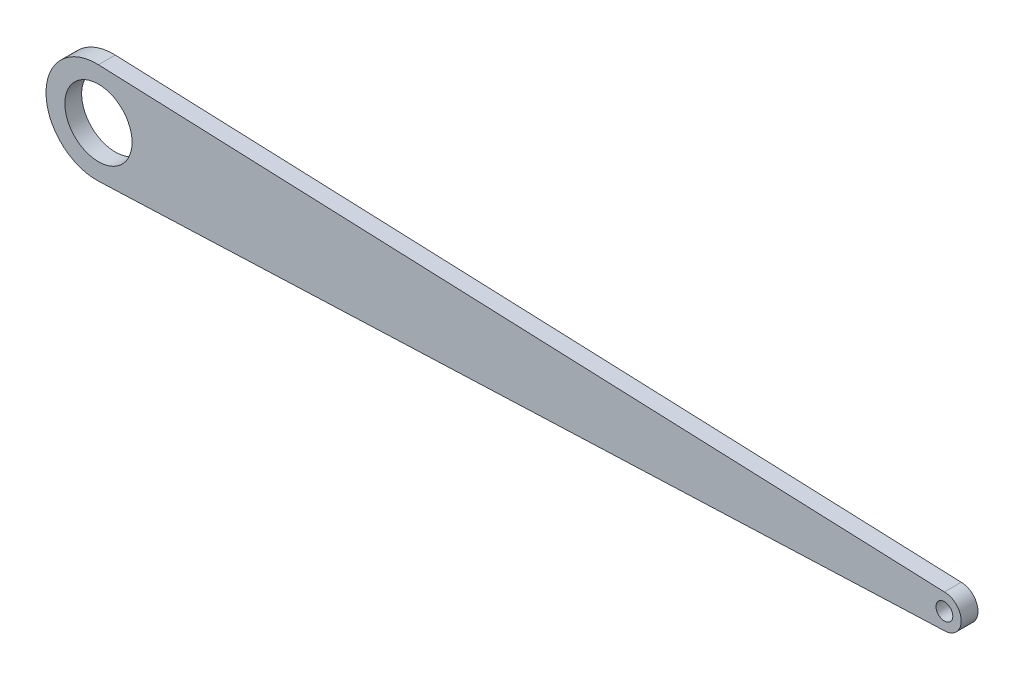
ISO-10303-21;
HEADER;
FILE_DESCRIPTION(('STEP AP214'),'2;1');
FILE_NAME('part.step','',(''),(''),'','','');
FILE_SCHEMA(('AUTOMOTIVE_DESIGN { 1 0 10303 214 1 1 1 1 }'));
ENDSEC;
DATA;
#1=APPLICATION_CONTEXT('core data for automotive mechanical design processes');
#2=APPLICATION_PROTOCOL_DEFINITION('international standard','automotive_design',2000,#1);
#3=PRODUCT_CONTEXT('',#1,'mechanical');
#4=PRODUCT('Part','Part','',(#3));
#5=PRODUCT_RELATED_PRODUCT_CATEGORY('part','',(#4));
#6=PRODUCT_DEFINITION_FORMATION('','',#4);
#7=PRODUCT_DEFINITION_CONTEXT('part definition',#1,'design');
#8=PRODUCT_DEFINITION('design','',#6,#7);
#9=PRODUCT_DEFINITION_SHAPE('','',#8);
#10=(LENGTH_UNIT() NAMED_UNIT(*) SI_UNIT(.MILLI.,.METRE.));
#11=(NAMED_UNIT(*) PLANE_ANGLE_UNIT() SI_UNIT($,.RADIAN.));
#12=(NAMED_UNIT(*) SI_UNIT($,.STERADIAN.) SOLID_ANGLE_UNIT());
#13=UNCERTAINTY_MEASURE_WITH_UNIT(LENGTH_MEASURE(1.E-05),#10,'distance_accuracy_value','');
#14=(GEOMETRIC_REPRESENTATION_CONTEXT(3) GLOBAL_UNCERTAINTY_ASSIGNED_CONTEXT((#13)) GLOBAL_UNIT_ASSIGNED_CONTEXT((#10,
#11,#12)) REPRESENTATION_CONTEXT('',''));
#15=CARTESIAN_POINT('',(0.,0.,0.));
#16=DIRECTION('',(0.,0.,1.));
#17=DIRECTION('',(1.,0.,0.));
#18=AXIS2_PLACEMENT_3D('',#15,#16,#17);
#19=CARTESIAN_POINT('',(125.899022009944,0.,5.));
#20=DIRECTION('',(0.,0.,-1.));
#21=DIRECTION('',(-1.,0.,0.));
#22=AXIS2_PLACEMENT_3D('',#19,#20,#21);
#23=PLANE('',#22);
#24=CARTESIAN_POINT('',(125.899022009944,0.,5.));
#25=DIRECTION('',(0.,0.,1.));
#26=DIRECTION('',(-1.,0.,0.));
#27=AXIS2_PLACEMENT_3D('',#24,#25,#26);
#28=CIRCLE('',#27,5.);
#29=CARTESIAN_POINT('',(125.899022009944,-5.,5.));
#30=VERTEX_POINT('',#29);
#31=CARTESIAN_POINT('',(125.899022009944,5.,5.));
#32=VERTEX_POINT('',#31);
#33=EDGE_CURVE('E96',#30,#32,#28,.T.);
#34=ORIENTED_EDGE('',*,*,#33,.T.);
#35=DIRECTION('',(-0.999211577977909,0.0397016679107561,0.));
#36=VECTOR('',#35,1.);
#37=CARTESIAN_POINT('',(-125.780977990056,15.,5.));
#38=LINE('',#37,#36);
#39=CARTESIAN_POINT('',(-125.780977990056,15.,5.));
#40=VERTEX_POINT('',#39);
#41=EDGE_CURVE('E91',#32,#40,#38,.T.);
#42=ORIENTED_EDGE('',*,*,#41,.T.);
#43=CARTESIAN_POINT('',(-126.376972904232,0.,5.));
#44=DIRECTION('',(0.,0.,1.));
#45=DIRECTION('',(1.,0.,0.));
#46=AXIS2_PLACEMENT_3D('',#43,#44,#45);
#47=CIRCLE('',#46,15.0118356618278);
#48=CARTESIAN_POINT('',(-125.780977990056,-15.,5.));
#49=VERTEX_POINT('',#48);
#50=EDGE_CURVE('E94',#40,#49,#47,.T.);
#51=ORIENTED_EDGE('',*,*,#50,.T.);
#52=DIRECTION('',(0.999211577977909,0.0397016679107561,0.));
#53=VECTOR('',#52,1.);
#54=CARTESIAN_POINT('',(125.899022009944,-5.,5.));
#55=LINE('',#54,#53);
#56=EDGE_CURVE('E61',#49,#30,#55,.T.);
#57=ORIENTED_EDGE('',*,*,#56,.T.);
#58=EDGE_LOOP('',(#34,#42,#51,#57));
#59=FACE_BOUND('',#58,.T.);
#60=CARTESIAN_POINT('',(125.899022009944,0.,5.));
#61=DIRECTION('',(0.,0.,1.));
#62=DIRECTION('',(1.,0.,0.));
#63=AXIS2_PLACEMENT_3D('',#60,#61,#62);
#64=CIRCLE('',#63,2.5);
#65=CARTESIAN_POINT('',(128.399022009944,0.,5.));
#66=VERTEX_POINT('',#65);
#67=EDGE_CURVE('E116',#66,#66,#64,.T.);
#68=ORIENTED_EDGE('',*,*,#67,.F.);
#69=EDGE_LOOP('',(#68));
#70=FACE_BOUND('',#69,.T.);
#71=CARTESIAN_POINT('',(-125.780977990056,0.,5.));
#72=DIRECTION('',(0.,0.,1.));
#73=DIRECTION('',(1.,0.,0.));
#74=AXIS2_PLACEMENT_3D('',#71,#72,#73);
#75=CIRCLE('',#74,9.99999999999999);
#76=CARTESIAN_POINT('',(-115.780977990056,0.,5.));
#77=VERTEX_POINT('',#76);
#78=EDGE_CURVE('E138',#77,#77,#75,.T.);
#79=ORIENTED_EDGE('',*,*,#78,.F.);
#80=EDGE_LOOP('',(#79));
#81=FACE_BOUND('',#80,.T.);
#82=ADVANCED_FACE('F43',(#59,#70,#81),#23,.F.);
#83=CARTESIAN_POINT('',(125.899022009944,0.,0.));
#84=DIRECTION('',(0.,0.,-1.));
#85=DIRECTION('',(-1.,0.,0.));
#86=AXIS2_PLACEMENT_3D('',#83,#84,#85);
#87=PLANE('',#86);
#88=CARTESIAN_POINT('',(125.899022009944,0.,0.));
#89=DIRECTION('',(0.,0.,1.));
#90=DIRECTION('',(1.,0.,0.));
#91=AXIS2_PLACEMENT_3D('',#88,#89,#90);
#92=CIRCLE('',#91,2.5);
#93=CARTESIAN_POINT('',(128.399022009944,0.,0.));
#94=VERTEX_POINT('',#93);
#95=EDGE_CURVE('E134',#94,#94,#92,.T.);
#96=ORIENTED_EDGE('',*,*,#95,.T.);
#97=EDGE_LOOP('',(#96));
#98=FACE_BOUND('',#97,.T.);
#99=CARTESIAN_POINT('',(125.899022009944,0.,0.));
#100=DIRECTION('',(0.,0.,1.));
#101=DIRECTION('',(-1.,0.,0.));
#102=AXIS2_PLACEMENT_3D('',#99,#100,#101);
#103=CIRCLE('',#102,5.);
#104=CARTESIAN_POINT('',(125.899022009944,-5.,0.));
#105=VERTEX_POINT('',#104);
#106=CARTESIAN_POINT('',(125.899022009944,5.,0.));
#107=VERTEX_POINT('',#106);
#108=EDGE_CURVE('E112',#105,#107,#103,.T.);
#109=ORIENTED_EDGE('',*,*,#108,.F.);
#110=DIRECTION('',(0.999211577977909,0.0397016679107561,0.));
#111=VECTOR('',#110,1.);
#112=CARTESIAN_POINT('',(125.899022009944,-5.,0.));
#113=LINE('',#112,#111);
#114=CARTESIAN_POINT('',(-125.780977990056,-15.,0.));
#115=VERTEX_POINT('',#114);
#116=EDGE_CURVE('E84',#115,#105,#113,.T.);
#117=ORIENTED_EDGE('',*,*,#116,.F.);
#118=CARTESIAN_POINT('',(-126.376972904232,0.,0.));
#119=DIRECTION('',(0.,0.,1.));
#120=DIRECTION('',(1.,0.,0.));
#121=AXIS2_PLACEMENT_3D('',#118,#119,#120);
#122=CIRCLE('',#121,15.0118356618278);
#123=CARTESIAN_POINT('',(-125.780977990056,15.,0.));
#124=VERTEX_POINT('',#123);
#125=EDGE_CURVE('E78',#124,#115,#122,.T.);
#126=ORIENTED_EDGE('',*,*,#125,.F.);
#127=DIRECTION('',(-0.999211577977909,0.0397016679107561,0.));
#128=VECTOR('',#127,1.);
#129=CARTESIAN_POINT('',(-125.780977990056,15.,0.));
#130=LINE('',#129,#128);
#131=EDGE_CURVE('E101',#107,#124,#130,.T.);
#132=ORIENTED_EDGE('',*,*,#131,.F.);
#133=EDGE_LOOP('',(#109,#117,#126,#132));
#134=FACE_BOUND('',#133,.T.);
#135=CARTESIAN_POINT('',(-125.780977990056,0.,0.));
#136=DIRECTION('',(0.,0.,1.));
#137=DIRECTION('',(1.,0.,0.));
#138=AXIS2_PLACEMENT_3D('',#135,#136,#137);
#139=CIRCLE('',#138,9.99999999999999);
#140=CARTESIAN_POINT('',(-115.780977990056,0.,0.));
#141=VERTEX_POINT('',#140);
#142=EDGE_CURVE('E142',#141,#141,#139,.T.);
#143=ORIENTED_EDGE('',*,*,#142,.T.);
#144=EDGE_LOOP('',(#143));
#145=FACE_BOUND('',#144,.T.);
#146=ADVANCED_FACE('F129',(#98,#134,#145),#87,.T.);
#147=CARTESIAN_POINT('',(125.899022009944,0.,5.));
#148=DIRECTION('',(0.,0.,-1.));
#149=DIRECTION('',(-1.,0.,0.));
#150=AXIS2_PLACEMENT_3D('',#147,#148,#149);
#151=CYLINDRICAL_SURFACE('',#150,5.);
#152=ORIENTED_EDGE('',*,*,#108,.T.);
#153=DIRECTION('',(0.,0.,-1.));
#154=VECTOR('',#153,1.);
#155=CARTESIAN_POINT('',(125.899022009944,5.,5.));
#156=LINE('',#155,#154);
#157=EDGE_CURVE('E11',#32,#107,#156,.T.);
#158=ORIENTED_EDGE('',*,*,#157,.F.);
#159=ORIENTED_EDGE('',*,*,#33,.F.);
#160=DIRECTION('',(0.,0.,-1.));
#161=VECTOR('',#160,1.);
#162=CARTESIAN_POINT('',(125.899022009944,-5.,5.));
#163=LINE('',#162,#161);
#164=EDGE_CURVE('E108',#30,#105,#163,.T.);
#165=ORIENTED_EDGE('',*,*,#164,.T.);
#166=EDGE_LOOP('',(#152,#158,#159,#165));
#167=FACE_BOUND('',#166,.T.);
#168=ADVANCED_FACE('F45',(#167),#151,.T.);
#169=CARTESIAN_POINT('',(-125.780977990056,15.,5.));
#170=DIRECTION('',(-0.0397016679107561,-0.99921157797791,0.));
#171=DIRECTION('',(0.99921157797791,-0.0397016679107561,0.));
#172=AXIS2_PLACEMENT_3D('',#169,#170,#171);
#173=PLANE('',#172);
#174=ORIENTED_EDGE('',*,*,#131,.T.);
#175=DIRECTION('',(0.,0.,-1.));
#176=VECTOR('',#175,1.);
#177=CARTESIAN_POINT('',(-125.780977990056,15.,5.));
#178=LINE('',#177,#176);
#179=EDGE_CURVE('E53',#40,#124,#178,.T.);
#180=ORIENTED_EDGE('',*,*,#179,.F.);
#181=ORIENTED_EDGE('',*,*,#41,.F.);
#182=ORIENTED_EDGE('',*,*,#157,.T.);
#183=EDGE_LOOP('',(#174,#180,#181,#182));
#184=FACE_BOUND('',#183,.T.);
#185=ADVANCED_FACE('F100',(#184),#173,.F.);
#186=CARTESIAN_POINT('',(-126.376972904232,0.,5.));
#187=DIRECTION('',(0.,0.,-1.));
#188=DIRECTION('',(-1.,0.,0.));
#189=AXIS2_PLACEMENT_3D('',#186,#187,#188);
#190=CYLINDRICAL_SURFACE('',#189,15.0118356618278);
#191=ORIENTED_EDGE('',*,*,#125,.T.);
#192=DIRECTION('',(0.,0.,-1.));
#193=VECTOR('',#192,1.);
#194=CARTESIAN_POINT('',(-125.780977990056,-15.,5.));
#195=LINE('',#194,#193);
#196=EDGE_CURVE('E103',#49,#115,#195,.T.);
#197=ORIENTED_EDGE('',*,*,#196,.F.);
#198=ORIENTED_EDGE('',*,*,#50,.F.);
#199=ORIENTED_EDGE('',*,*,#179,.T.);
#200=EDGE_LOOP('',(#191,#197,#198,#199));
#201=FACE_BOUND('',#200,.T.);
#202=ADVANCED_FACE('F104',(#201),#190,.T.);
#203=CARTESIAN_POINT('',(125.899022009944,-5.,5.));
#204=DIRECTION('',(-0.0397016679107561,0.99921157797791,0.));
#205=DIRECTION('',(-0.99921157797791,-0.0397016679107561,0.));
#206=AXIS2_PLACEMENT_3D('',#203,#204,#205);
#207=PLANE('',#206);
#208=ORIENTED_EDGE('',*,*,#116,.T.);
#209=ORIENTED_EDGE('',*,*,#164,.F.);
#210=ORIENTED_EDGE('',*,*,#56,.F.);
#211=ORIENTED_EDGE('',*,*,#196,.T.);
#212=EDGE_LOOP('',(#208,#209,#210,#211));
#213=FACE_BOUND('',#212,.T.);
#214=ADVANCED_FACE('F126',(#213),#207,.F.);
#215=CARTESIAN_POINT('',(125.899022009944,0.,5.));
#216=DIRECTION('',(0.,0.,-1.));
#217=DIRECTION('',(-1.,0.,0.));
#218=AXIS2_PLACEMENT_3D('',#215,#216,#217);
#219=CYLINDRICAL_SURFACE('',#218,2.5);
#220=ORIENTED_EDGE('',*,*,#67,.T.);
#221=EDGE_LOOP('',(#220));
#222=FACE_BOUND('',#221,.T.);
#223=ORIENTED_EDGE('',*,*,#95,.F.);
#224=EDGE_LOOP('',(#223));
#225=FACE_BOUND('',#224,.T.);
#226=ADVANCED_FACE('F161',(#222,#225),#219,.F.);
#227=CARTESIAN_POINT('',(-125.780977990056,0.,5.));
#228=DIRECTION('',(0.,0.,-1.));
#229=DIRECTION('',(-1.,0.,0.));
#230=AXIS2_PLACEMENT_3D('',#227,#228,#229);
#231=CYLINDRICAL_SURFACE('',#230,9.99999999999999);
#232=ORIENTED_EDGE('',*,*,#78,.T.);
#233=EDGE_LOOP('',(#232));
#234=FACE_BOUND('',#233,.T.);
#235=ORIENTED_EDGE('',*,*,#142,.F.);
#236=EDGE_LOOP('',(#235));
#237=FACE_BOUND('',#236,.T.);
#238=ADVANCED_FACE('F150',(#234,#237),#231,.F.);
#239=CLOSED_SHELL('',(#82,#146,#168,#185,#202,#214,#226,#238));
#240=MANIFOLD_SOLID_BREP('B2',#239);
#241=ADVANCED_BREP_SHAPE_REPRESENTATION('',(#18,#240),#14);
#242=SHAPE_DEFINITION_REPRESENTATION(#9,#241);
ENDSEC;
END-ISO-10303-21;
